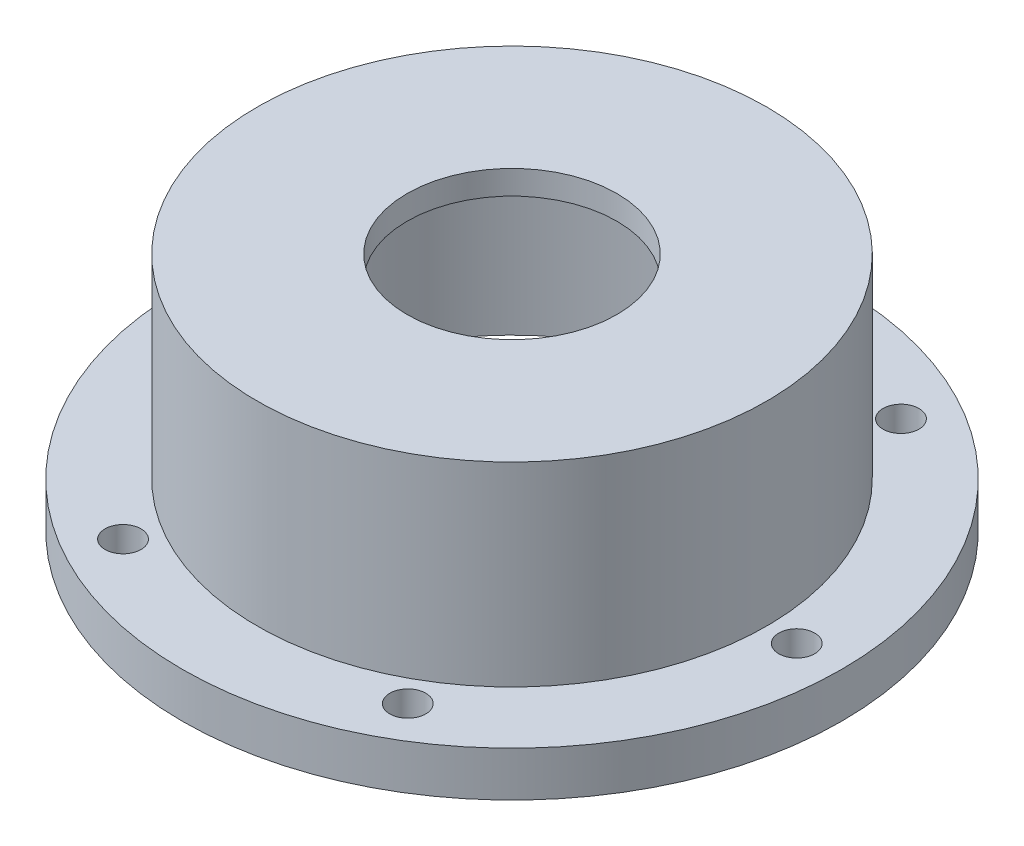
ISO-10303-21;
HEADER;
FILE_DESCRIPTION(('STEP AP214'),'2;1');
FILE_NAME('part.step','',(''),(''),'','','');
FILE_SCHEMA(('AUTOMOTIVE_DESIGN { 1 0 10303 214 1 1 1 1 }'));
ENDSEC;
DATA;
#1=APPLICATION_CONTEXT('core data for automotive mechanical design processes');
#2=APPLICATION_PROTOCOL_DEFINITION('international standard','automotive_design',2000,#1);
#3=PRODUCT_CONTEXT('',#1,'mechanical');
#4=PRODUCT('Part','Part','',(#3));
#5=PRODUCT_RELATED_PRODUCT_CATEGORY('part','',(#4));
#6=PRODUCT_DEFINITION_FORMATION('','',#4);
#7=PRODUCT_DEFINITION_CONTEXT('part definition',#1,'design');
#8=PRODUCT_DEFINITION('design','',#6,#7);
#9=PRODUCT_DEFINITION_SHAPE('','',#8);
#10=(LENGTH_UNIT() NAMED_UNIT(*) SI_UNIT(.MILLI.,.METRE.));
#11=(NAMED_UNIT(*) PLANE_ANGLE_UNIT() SI_UNIT($,.RADIAN.));
#12=(NAMED_UNIT(*) SI_UNIT($,.STERADIAN.) SOLID_ANGLE_UNIT());
#13=UNCERTAINTY_MEASURE_WITH_UNIT(LENGTH_MEASURE(1.E-05),#10,'distance_accuracy_value','');
#14=(GEOMETRIC_REPRESENTATION_CONTEXT(3) GLOBAL_UNCERTAINTY_ASSIGNED_CONTEXT((#13)) GLOBAL_UNIT_ASSIGNED_CONTEXT((#10,
#11,#12)) REPRESENTATION_CONTEXT('',''));
#15=CARTESIAN_POINT('',(0.,0.,0.));
#16=DIRECTION('',(0.,0.,1.));
#17=DIRECTION('',(1.,0.,0.));
#18=AXIS2_PLACEMENT_3D('',#15,#16,#17);
#19=CARTESIAN_POINT('',(0.,72.,0.));
#20=DIRECTION('',(0.,-1.,0.));
#21=DIRECTION('',(0.,0.,-1.));
#22=AXIS2_PLACEMENT_3D('',#19,#20,#21);
#23=PLANE('',#22);
#24=CARTESIAN_POINT('',(0.,72.,58.5));
#25=DIRECTION('',(0.,-1.,0.));
#26=DIRECTION('',(0.,0.,-1.));
#27=AXIS2_PLACEMENT_3D('',#24,#25,#26);
#28=CIRCLE('',#27,10.);
#29=CARTESIAN_POINT('',(0.,72.,48.5));
#30=VERTEX_POINT('',#29);
#31=EDGE_CURVE('E118',#30,#30,#28,.T.);
#32=ORIENTED_EDGE('',*,*,#31,.F.);
#33=EDGE_LOOP('',(#32));
#34=FACE_BOUND('',#33,.T.);
#35=CARTESIAN_POINT('',(58.5,72.,0.));
#36=DIRECTION('',(0.,-1.,0.));
#37=DIRECTION('',(0.,0.,-1.));
#38=AXIS2_PLACEMENT_3D('',#35,#36,#37);
#39=CIRCLE('',#38,10.0000000000002);
#40=CARTESIAN_POINT('',(58.5,72.,-10.0000000000002));
#41=VERTEX_POINT('',#40);
#42=EDGE_CURVE('E112',#41,#41,#39,.T.);
#43=ORIENTED_EDGE('',*,*,#42,.F.);
#44=EDGE_LOOP('',(#43));
#45=FACE_BOUND('',#44,.T.);
#46=CARTESIAN_POINT('',(0.,72.,-58.5));
#47=DIRECTION('',(0.,-1.,0.));
#48=DIRECTION('',(0.,0.,-1.));
#49=AXIS2_PLACEMENT_3D('',#46,#47,#48);
#50=CIRCLE('',#49,10.0000000000004);
#51=CARTESIAN_POINT('',(0.,72.,-68.5000000000004));
#52=VERTEX_POINT('',#51);
#53=EDGE_CURVE('E106',#52,#52,#50,.T.);
#54=ORIENTED_EDGE('',*,*,#53,.F.);
#55=EDGE_LOOP('',(#54));
#56=FACE_BOUND('',#55,.T.);
#57=CARTESIAN_POINT('',(-58.5,72.,0.));
#58=DIRECTION('',(0.,-1.,0.));
#59=DIRECTION('',(0.,0.,-1.));
#60=AXIS2_PLACEMENT_3D('',#57,#58,#59);
#61=CIRCLE('',#60,10.0000000000006);
#62=CARTESIAN_POINT('',(-58.5,72.,-10.0000000000006));
#63=VERTEX_POINT('',#62);
#64=EDGE_CURVE('E100',#63,#63,#61,.T.);
#65=ORIENTED_EDGE('',*,*,#64,.F.);
#66=EDGE_LOOP('',(#65));
#67=FACE_BOUND('',#66,.T.);
#68=CARTESIAN_POINT('',(0.,72.,0.));
#69=DIRECTION('',(0.,-1.,0.));
#70=DIRECTION('',(0.,0.,-1.));
#71=AXIS2_PLACEMENT_3D('',#68,#69,#70);
#72=CIRCLE('',#71,35.);
#73=CARTESIAN_POINT('',(0.,72.,-35.));
#74=VERTEX_POINT('',#73);
#75=EDGE_CURVE('E57',#74,#74,#72,.F.);
#76=ORIENTED_EDGE('',*,*,#75,.T.);
#77=EDGE_LOOP('',(#76));
#78=FACE_BOUND('',#77,.T.);
#79=CARTESIAN_POINT('',(0.,72.,0.));
#80=DIRECTION('',(0.,-1.,0.));
#81=DIRECTION('',(0.,0.,-1.));
#82=AXIS2_PLACEMENT_3D('',#79,#80,#81);
#83=CIRCLE('',#82,80.);
#84=CARTESIAN_POINT('',(0.,72.,-80.));
#85=VERTEX_POINT('',#84);
#86=EDGE_CURVE('E54',#85,#85,#83,.T.);
#87=ORIENTED_EDGE('',*,*,#86,.T.);
#88=EDGE_LOOP('',(#87));
#89=FACE_BOUND('',#88,.T.);
#90=ADVANCED_FACE('F32',(#34,#45,#56,#67,#78,#89),#23,.T.);
#91=CARTESIAN_POINT('',(0.,80.,0.));
#92=DIRECTION('',(0.,1.,0.));
#93=DIRECTION('',(0.,0.,1.));
#94=AXIS2_PLACEMENT_3D('',#91,#92,#93);
#95=PLANE('',#94);
#96=CARTESIAN_POINT('',(0.,80.,0.));
#97=DIRECTION('',(0.,1.,0.));
#98=DIRECTION('',(0.,0.,1.));
#99=AXIS2_PLACEMENT_3D('',#96,#97,#98);
#100=CIRCLE('',#99,35.);
#101=CARTESIAN_POINT('',(0.,80.,35.));
#102=VERTEX_POINT('',#101);
#103=EDGE_CURVE('E60',#102,#102,#100,.T.);
#104=ORIENTED_EDGE('',*,*,#103,.F.);
#105=EDGE_LOOP('',(#104));
#106=FACE_BOUND('',#105,.T.);
#107=CARTESIAN_POINT('',(0.,80.,0.));
#108=DIRECTION('',(0.,-1.,0.));
#109=DIRECTION('',(0.,0.,-1.));
#110=AXIS2_PLACEMENT_3D('',#107,#108,#109);
#111=CIRCLE('',#110,85.);
#112=CARTESIAN_POINT('',(0.,80.,-85.));
#113=VERTEX_POINT('',#112);
#114=EDGE_CURVE('E10',#113,#113,#111,.T.);
#115=ORIENTED_EDGE('',*,*,#114,.F.);
#116=EDGE_LOOP('',(#115));
#117=FACE_BOUND('',#116,.T.);
#118=ADVANCED_FACE('F135',(#106,#117),#95,.T.);
#119=CARTESIAN_POINT('',(0.,0.,0.));
#120=DIRECTION('',(0.,-1.,0.));
#121=DIRECTION('',(0.,0.,-1.));
#122=AXIS2_PLACEMENT_3D('',#119,#120,#121);
#123=CYLINDRICAL_SURFACE('',#122,85.);
#124=ORIENTED_EDGE('',*,*,#114,.T.);
#125=EDGE_LOOP('',(#124));
#126=FACE_BOUND('',#125,.T.);
#127=CARTESIAN_POINT('',(0.,15.,0.));
#128=DIRECTION('',(0.,-1.,0.));
#129=DIRECTION('',(0.,0.,-1.));
#130=AXIS2_PLACEMENT_3D('',#127,#128,#129);
#131=CIRCLE('',#130,85.);
#132=CARTESIAN_POINT('',(0.,15.,-85.));
#133=VERTEX_POINT('',#132);
#134=EDGE_CURVE('E38',#133,#133,#131,.T.);
#135=ORIENTED_EDGE('',*,*,#134,.F.);
#136=EDGE_LOOP('',(#135));
#137=FACE_BOUND('',#136,.T.);
#138=ADVANCED_FACE('F170',(#126,#137),#123,.T.);
#139=CARTESIAN_POINT('',(0.,15.,0.));
#140=DIRECTION('',(0.,1.,0.));
#141=DIRECTION('',(0.,0.,1.));
#142=AXIS2_PLACEMENT_3D('',#139,#140,#141);
#143=PLANE('',#142);
#144=CARTESIAN_POINT('',(-95.,15.,0.));
#145=DIRECTION('',(0.,1.,0.));
#146=DIRECTION('',(0.,0.,1.));
#147=AXIS2_PLACEMENT_3D('',#144,#145,#146);
#148=CIRCLE('',#147,5.99999999999999);
#149=CARTESIAN_POINT('',(-95.,15.,5.99999999999999));
#150=VERTEX_POINT('',#149);
#151=EDGE_CURVE('E96',#150,#150,#148,.T.);
#152=ORIENTED_EDGE('',*,*,#151,.F.);
#153=EDGE_LOOP('',(#152));
#154=FACE_BOUND('',#153,.T.);
#155=CARTESIAN_POINT('',(-47.5,15.,-82.2724133595217));
#156=DIRECTION('',(0.,1.,0.));
#157=DIRECTION('',(0.,0.,1.));
#158=AXIS2_PLACEMENT_3D('',#155,#156,#157);
#159=CIRCLE('',#158,5.99999999999998);
#160=CARTESIAN_POINT('',(-47.5,15.,-76.2724133595217));
#161=VERTEX_POINT('',#160);
#162=EDGE_CURVE('E90',#161,#161,#159,.T.);
#163=ORIENTED_EDGE('',*,*,#162,.F.);
#164=EDGE_LOOP('',(#163));
#165=FACE_BOUND('',#164,.T.);
#166=CARTESIAN_POINT('',(47.5000000000004,15.,-82.2724133595215));
#167=DIRECTION('',(0.,1.,0.));
#168=DIRECTION('',(0.,0.,1.));
#169=AXIS2_PLACEMENT_3D('',#166,#167,#168);
#170=CIRCLE('',#169,5.99999999999999);
#171=CARTESIAN_POINT('',(47.5000000000004,15.,-76.2724133595215));
#172=VERTEX_POINT('',#171);
#173=EDGE_CURVE('E84',#172,#172,#170,.T.);
#174=ORIENTED_EDGE('',*,*,#173,.F.);
#175=EDGE_LOOP('',(#174));
#176=FACE_BOUND('',#175,.T.);
#177=CARTESIAN_POINT('',(95.,15.,6.63381454380195E-13));
#178=DIRECTION('',(0.,1.,0.));
#179=DIRECTION('',(0.,0.,1.));
#180=AXIS2_PLACEMENT_3D('',#177,#178,#179);
#181=CIRCLE('',#180,5.99999999999999);
#182=CARTESIAN_POINT('',(95.,15.,6.00000000000065));
#183=VERTEX_POINT('',#182);
#184=EDGE_CURVE('E78',#183,#183,#181,.T.);
#185=ORIENTED_EDGE('',*,*,#184,.F.);
#186=EDGE_LOOP('',(#185));
#187=FACE_BOUND('',#186,.T.);
#188=CARTESIAN_POINT('',(47.4999999999993,15.,82.2724133595221));
#189=DIRECTION('',(0.,1.,0.));
#190=DIRECTION('',(0.,0.,1.));
#191=AXIS2_PLACEMENT_3D('',#188,#189,#190);
#192=CIRCLE('',#191,5.99999999999999);
#193=CARTESIAN_POINT('',(47.4999999999993,15.,88.2724133595221));
#194=VERTEX_POINT('',#193);
#195=EDGE_CURVE('E72',#194,#194,#192,.T.);
#196=ORIENTED_EDGE('',*,*,#195,.F.);
#197=EDGE_LOOP('',(#196));
#198=FACE_BOUND('',#197,.T.);
#199=CARTESIAN_POINT('',(-47.500000000001,15.,82.2724133595212));
#200=DIRECTION('',(0.,1.,0.));
#201=DIRECTION('',(0.,0.,1.));
#202=AXIS2_PLACEMENT_3D('',#199,#200,#201);
#203=CIRCLE('',#202,5.99999999999998);
#204=CARTESIAN_POINT('',(-47.500000000001,15.,88.2724133595211));
#205=VERTEX_POINT('',#204);
#206=EDGE_CURVE('E66',#205,#205,#203,.T.);
#207=ORIENTED_EDGE('',*,*,#206,.F.);
#208=EDGE_LOOP('',(#207));
#209=FACE_BOUND('',#208,.T.);
#210=ORIENTED_EDGE('',*,*,#134,.T.);
#211=EDGE_LOOP('',(#210));
#212=FACE_BOUND('',#211,.T.);
#213=CARTESIAN_POINT('',(0.,15.,0.));
#214=DIRECTION('',(0.,-1.,0.));
#215=DIRECTION('',(0.,0.,-1.));
#216=AXIS2_PLACEMENT_3D('',#213,#214,#215);
#217=CIRCLE('',#216,110.);
#218=CARTESIAN_POINT('',(0.,15.,-110.));
#219=VERTEX_POINT('',#218);
#220=EDGE_CURVE('E42',#219,#219,#217,.T.);
#221=ORIENTED_EDGE('',*,*,#220,.F.);
#222=EDGE_LOOP('',(#221));
#223=FACE_BOUND('',#222,.T.);
#224=ADVANCED_FACE('F166',(#154,#165,#176,#187,#198,#209,#212,#223),#143,.T.);
#225=CARTESIAN_POINT('',(0.,0.,0.));
#226=DIRECTION('',(0.,-1.,0.));
#227=DIRECTION('',(0.,0.,-1.));
#228=AXIS2_PLACEMENT_3D('',#225,#226,#227);
#229=CYLINDRICAL_SURFACE('',#228,110.);
#230=ORIENTED_EDGE('',*,*,#220,.T.);
#231=EDGE_LOOP('',(#230));
#232=FACE_BOUND('',#231,.T.);
#233=CARTESIAN_POINT('',(0.,0.,0.));
#234=DIRECTION('',(0.,-1.,0.));
#235=DIRECTION('',(0.,0.,-1.));
#236=AXIS2_PLACEMENT_3D('',#233,#234,#235);
#237=CIRCLE('',#236,110.);
#238=CARTESIAN_POINT('',(0.,0.,-110.));
#239=VERTEX_POINT('',#238);
#240=EDGE_CURVE('E46',#239,#239,#237,.T.);
#241=ORIENTED_EDGE('',*,*,#240,.F.);
#242=EDGE_LOOP('',(#241));
#243=FACE_BOUND('',#242,.T.);
#244=ADVANCED_FACE('F159',(#232,#243),#229,.T.);
#245=CARTESIAN_POINT('',(0.,0.,0.));
#246=DIRECTION('',(0.,-1.,0.));
#247=DIRECTION('',(0.,0.,-1.));
#248=AXIS2_PLACEMENT_3D('',#245,#246,#247);
#249=PLANE('',#248);
#250=CARTESIAN_POINT('',(-95.,0.,0.));
#251=DIRECTION('',(0.,1.,0.));
#252=DIRECTION('',(0.,0.,1.));
#253=AXIS2_PLACEMENT_3D('',#250,#251,#252);
#254=CIRCLE('',#253,5.99999999999999);
#255=CARTESIAN_POINT('',(-95.,0.,5.99999999999999));
#256=VERTEX_POINT('',#255);
#257=EDGE_CURVE('E93',#256,#256,#254,.T.);
#258=ORIENTED_EDGE('',*,*,#257,.T.);
#259=EDGE_LOOP('',(#258));
#260=FACE_BOUND('',#259,.T.);
#261=CARTESIAN_POINT('',(-47.5,0.,-82.2724133595217));
#262=DIRECTION('',(0.,1.,0.));
#263=DIRECTION('',(0.,0.,1.));
#264=AXIS2_PLACEMENT_3D('',#261,#262,#263);
#265=CIRCLE('',#264,6.);
#266=CARTESIAN_POINT('',(-47.5,0.,-76.2724133595217));
#267=VERTEX_POINT('',#266);
#268=EDGE_CURVE('E87',#267,#267,#265,.T.);
#269=ORIENTED_EDGE('',*,*,#268,.T.);
#270=EDGE_LOOP('',(#269));
#271=FACE_BOUND('',#270,.T.);
#272=CARTESIAN_POINT('',(47.5000000000004,0.,-82.2724133595215));
#273=DIRECTION('',(0.,1.,0.));
#274=DIRECTION('',(0.,0.,1.));
#275=AXIS2_PLACEMENT_3D('',#272,#273,#274);
#276=CIRCLE('',#275,6.);
#277=CARTESIAN_POINT('',(47.5000000000004,0.,-76.2724133595215));
#278=VERTEX_POINT('',#277);
#279=EDGE_CURVE('E81',#278,#278,#276,.T.);
#280=ORIENTED_EDGE('',*,*,#279,.T.);
#281=EDGE_LOOP('',(#280));
#282=FACE_BOUND('',#281,.T.);
#283=CARTESIAN_POINT('',(95.,0.,6.63381454380195E-13));
#284=DIRECTION('',(0.,1.,0.));
#285=DIRECTION('',(0.,0.,1.));
#286=AXIS2_PLACEMENT_3D('',#283,#284,#285);
#287=CIRCLE('',#286,5.99999999999999);
#288=CARTESIAN_POINT('',(95.,0.,6.00000000000065));
#289=VERTEX_POINT('',#288);
#290=EDGE_CURVE('E75',#289,#289,#287,.T.);
#291=ORIENTED_EDGE('',*,*,#290,.T.);
#292=EDGE_LOOP('',(#291));
#293=FACE_BOUND('',#292,.T.);
#294=CARTESIAN_POINT('',(47.4999999999993,0.,82.2724133595221));
#295=DIRECTION('',(0.,1.,0.));
#296=DIRECTION('',(0.,0.,1.));
#297=AXIS2_PLACEMENT_3D('',#294,#295,#296);
#298=CIRCLE('',#297,6.);
#299=CARTESIAN_POINT('',(47.4999999999993,0.,88.2724133595221));
#300=VERTEX_POINT('',#299);
#301=EDGE_CURVE('E69',#300,#300,#298,.T.);
#302=ORIENTED_EDGE('',*,*,#301,.T.);
#303=EDGE_LOOP('',(#302));
#304=FACE_BOUND('',#303,.T.);
#305=CARTESIAN_POINT('',(-47.500000000001,0.,82.2724133595212));
#306=DIRECTION('',(0.,1.,0.));
#307=DIRECTION('',(0.,0.,1.));
#308=AXIS2_PLACEMENT_3D('',#305,#306,#307);
#309=CIRCLE('',#308,6.);
#310=CARTESIAN_POINT('',(-47.500000000001,0.,88.2724133595212));
#311=VERTEX_POINT('',#310);
#312=EDGE_CURVE('E63',#311,#311,#309,.T.);
#313=ORIENTED_EDGE('',*,*,#312,.T.);
#314=EDGE_LOOP('',(#313));
#315=FACE_BOUND('',#314,.T.);
#316=ORIENTED_EDGE('',*,*,#240,.T.);
#317=EDGE_LOOP('',(#316));
#318=FACE_BOUND('',#317,.T.);
#319=CARTESIAN_POINT('',(0.,0.,0.));
#320=DIRECTION('',(0.,-1.,0.));
#321=DIRECTION('',(0.,0.,-1.));
#322=AXIS2_PLACEMENT_3D('',#319,#320,#321);
#323=CIRCLE('',#322,80.);
#324=CARTESIAN_POINT('',(0.,0.,-80.));
#325=VERTEX_POINT('',#324);
#326=EDGE_CURVE('E51',#325,#325,#323,.T.);
#327=ORIENTED_EDGE('',*,*,#326,.F.);
#328=EDGE_LOOP('',(#327));
#329=FACE_BOUND('',#328,.T.);
#330=ADVANCED_FACE('F149',(#260,#271,#282,#293,#304,#315,#318,#329),#249,.T.);
#331=CARTESIAN_POINT('',(0.,0.,0.));
#332=DIRECTION('',(0.,-1.,0.));
#333=DIRECTION('',(0.,0.,-1.));
#334=AXIS2_PLACEMENT_3D('',#331,#332,#333);
#335=CYLINDRICAL_SURFACE('',#334,80.);
#336=ORIENTED_EDGE('',*,*,#326,.T.);
#337=EDGE_LOOP('',(#336));
#338=FACE_BOUND('',#337,.T.);
#339=ORIENTED_EDGE('',*,*,#86,.F.);
#340=EDGE_LOOP('',(#339));
#341=FACE_BOUND('',#340,.T.);
#342=ADVANCED_FACE('F146',(#338,#341),#335,.F.);
#343=CARTESIAN_POINT('',(0.,-26.9949493661167,0.));
#344=DIRECTION('',(0.,1.,0.));
#345=DIRECTION('',(0.,0.,1.));
#346=AXIS2_PLACEMENT_3D('',#343,#344,#345);
#347=CYLINDRICAL_SURFACE('',#346,35.);
#348=ORIENTED_EDGE('',*,*,#103,.T.);
#349=EDGE_LOOP('',(#348));
#350=FACE_BOUND('',#349,.T.);
#351=ORIENTED_EDGE('',*,*,#75,.F.);
#352=EDGE_LOOP('',(#351));
#353=FACE_BOUND('',#352,.T.);
#354=ADVANCED_FACE('F148',(#350,#353),#347,.F.);
#355=CARTESIAN_POINT('',(-47.500000000001,15.,82.2724133595212));
#356=DIRECTION('',(0.,1.,0.));
#357=DIRECTION('',(0.,0.,1.));
#358=AXIS2_PLACEMENT_3D('',#355,#356,#357);
#359=CYLINDRICAL_SURFACE('',#358,5.99999999999999);
#360=ORIENTED_EDGE('',*,*,#312,.F.);
#361=EDGE_LOOP('',(#360));
#362=FACE_BOUND('',#361,.T.);
#363=ORIENTED_EDGE('',*,*,#206,.T.);
#364=EDGE_LOOP('',(#363));
#365=FACE_BOUND('',#364,.T.);
#366=ADVANCED_FACE('F156',(#362,#365),#359,.F.);
#367=CARTESIAN_POINT('',(47.4999999999993,15.,82.2724133595221));
#368=DIRECTION('',(0.,1.,0.));
#369=DIRECTION('',(0.,0.,1.));
#370=AXIS2_PLACEMENT_3D('',#367,#368,#369);
#371=CYLINDRICAL_SURFACE('',#370,5.99999999999999);
#372=ORIENTED_EDGE('',*,*,#301,.F.);
#373=EDGE_LOOP('',(#372));
#374=FACE_BOUND('',#373,.T.);
#375=ORIENTED_EDGE('',*,*,#195,.T.);
#376=EDGE_LOOP('',(#375));
#377=FACE_BOUND('',#376,.T.);
#378=ADVANCED_FACE('F209',(#374,#377),#371,.F.);
#379=CARTESIAN_POINT('',(95.,15.,6.63381454380195E-13));
#380=DIRECTION('',(0.,1.,0.));
#381=DIRECTION('',(0.,0.,1.));
#382=AXIS2_PLACEMENT_3D('',#379,#380,#381);
#383=CYLINDRICAL_SURFACE('',#382,5.99999999999999);
#384=ORIENTED_EDGE('',*,*,#290,.F.);
#385=EDGE_LOOP('',(#384));
#386=FACE_BOUND('',#385,.T.);
#387=ORIENTED_EDGE('',*,*,#184,.T.);
#388=EDGE_LOOP('',(#387));
#389=FACE_BOUND('',#388,.T.);
#390=ADVANCED_FACE('F219',(#386,#389),#383,.F.);
#391=CARTESIAN_POINT('',(47.5000000000004,15.,-82.2724133595215));
#392=DIRECTION('',(0.,1.,0.));
#393=DIRECTION('',(0.,0.,1.));
#394=AXIS2_PLACEMENT_3D('',#391,#392,#393);
#395=CYLINDRICAL_SURFACE('',#394,5.99999999999999);
#396=ORIENTED_EDGE('',*,*,#279,.F.);
#397=EDGE_LOOP('',(#396));
#398=FACE_BOUND('',#397,.T.);
#399=ORIENTED_EDGE('',*,*,#173,.T.);
#400=EDGE_LOOP('',(#399));
#401=FACE_BOUND('',#400,.T.);
#402=ADVANCED_FACE('F229',(#398,#401),#395,.F.);
#403=CARTESIAN_POINT('',(-47.5,15.,-82.2724133595217));
#404=DIRECTION('',(0.,1.,0.));
#405=DIRECTION('',(0.,0.,1.));
#406=AXIS2_PLACEMENT_3D('',#403,#404,#405);
#407=CYLINDRICAL_SURFACE('',#406,5.99999999999999);
#408=ORIENTED_EDGE('',*,*,#268,.F.);
#409=EDGE_LOOP('',(#408));
#410=FACE_BOUND('',#409,.T.);
#411=ORIENTED_EDGE('',*,*,#162,.T.);
#412=EDGE_LOOP('',(#411));
#413=FACE_BOUND('',#412,.T.);
#414=ADVANCED_FACE('F239',(#410,#413),#407,.F.);
#415=CARTESIAN_POINT('',(-95.,15.,0.));
#416=DIRECTION('',(0.,1.,0.));
#417=DIRECTION('',(0.,0.,1.));
#418=AXIS2_PLACEMENT_3D('',#415,#416,#417);
#419=CYLINDRICAL_SURFACE('',#418,5.99999999999999);
#420=ORIENTED_EDGE('',*,*,#257,.F.);
#421=EDGE_LOOP('',(#420));
#422=FACE_BOUND('',#421,.T.);
#423=ORIENTED_EDGE('',*,*,#151,.T.);
#424=EDGE_LOOP('',(#423));
#425=FACE_BOUND('',#424,.T.);
#426=ADVANCED_FACE('F249',(#422,#425),#419,.F.);
#427=CARTESIAN_POINT('',(-58.5,75.,0.));
#428=DIRECTION('',(0.,-1.,0.));
#429=DIRECTION('',(0.,0.,-1.));
#430=AXIS2_PLACEMENT_3D('',#427,#428,#429);
#431=CYLINDRICAL_SURFACE('',#430,10.0000000000006);
#432=CARTESIAN_POINT('',(-58.5,75.,0.));
#433=DIRECTION('',(0.,-1.,0.));
#434=DIRECTION('',(0.,0.,-1.));
#435=AXIS2_PLACEMENT_3D('',#432,#433,#434);
#436=CIRCLE('',#435,10.0000000000006);
#437=CARTESIAN_POINT('',(-58.5,75.,-10.0000000000006));
#438=VERTEX_POINT('',#437);
#439=EDGE_CURVE('E103',#438,#438,#436,.T.);
#440=ORIENTED_EDGE('',*,*,#439,.F.);
#441=EDGE_LOOP('',(#440));
#442=FACE_BOUND('',#441,.T.);
#443=ORIENTED_EDGE('',*,*,#64,.T.);
#444=EDGE_LOOP('',(#443));
#445=FACE_BOUND('',#444,.T.);
#446=ADVANCED_FACE('F258',(#442,#445),#431,.F.);
#447=CARTESIAN_POINT('',(-58.5,75.,0.));
#448=DIRECTION('',(0.,-1.,0.));
#449=DIRECTION('',(0.,0.,-1.));
#450=AXIS2_PLACEMENT_3D('',#447,#448,#449);
#451=PLANE('',#450);
#452=ORIENTED_EDGE('',*,*,#439,.T.);
#453=EDGE_LOOP('',(#452));
#454=FACE_BOUND('',#453,.T.);
#455=ADVANCED_FACE('F273',(#454),#451,.T.);
#456=CARTESIAN_POINT('',(0.,75.,-58.5));
#457=DIRECTION('',(0.,-1.,0.));
#458=DIRECTION('',(0.,0.,-1.));
#459=AXIS2_PLACEMENT_3D('',#456,#457,#458);
#460=CYLINDRICAL_SURFACE('',#459,10.0000000000004);
#461=CARTESIAN_POINT('',(0.,75.,-58.5));
#462=DIRECTION('',(0.,-1.,0.));
#463=DIRECTION('',(0.,0.,-1.));
#464=AXIS2_PLACEMENT_3D('',#461,#462,#463);
#465=CIRCLE('',#464,10.0000000000004);
#466=CARTESIAN_POINT('',(0.,75.,-68.5000000000004));
#467=VERTEX_POINT('',#466);
#468=EDGE_CURVE('E109',#467,#467,#465,.T.);
#469=ORIENTED_EDGE('',*,*,#468,.F.);
#470=EDGE_LOOP('',(#469));
#471=FACE_BOUND('',#470,.T.);
#472=ORIENTED_EDGE('',*,*,#53,.T.);
#473=EDGE_LOOP('',(#472));
#474=FACE_BOUND('',#473,.T.);
#475=ADVANCED_FACE('F283',(#471,#474),#460,.F.);
#476=CARTESIAN_POINT('',(0.,75.,-58.5));
#477=DIRECTION('',(0.,-1.,0.));
#478=DIRECTION('',(0.,0.,-1.));
#479=AXIS2_PLACEMENT_3D('',#476,#477,#478);
#480=PLANE('',#479);
#481=ORIENTED_EDGE('',*,*,#468,.T.);
#482=EDGE_LOOP('',(#481));
#483=FACE_BOUND('',#482,.T.);
#484=ADVANCED_FACE('F293',(#483),#480,.T.);
#485=CARTESIAN_POINT('',(58.5,75.,0.));
#486=DIRECTION('',(0.,-1.,0.));
#487=DIRECTION('',(0.,0.,-1.));
#488=AXIS2_PLACEMENT_3D('',#485,#486,#487);
#489=CYLINDRICAL_SURFACE('',#488,10.0000000000002);
#490=CARTESIAN_POINT('',(58.5,75.,0.));
#491=DIRECTION('',(0.,-1.,0.));
#492=DIRECTION('',(0.,0.,-1.));
#493=AXIS2_PLACEMENT_3D('',#490,#491,#492);
#494=CIRCLE('',#493,10.0000000000002);
#495=CARTESIAN_POINT('',(58.5,75.,-10.0000000000002));
#496=VERTEX_POINT('',#495);
#497=EDGE_CURVE('E115',#496,#496,#494,.T.);
#498=ORIENTED_EDGE('',*,*,#497,.F.);
#499=EDGE_LOOP('',(#498));
#500=FACE_BOUND('',#499,.T.);
#501=ORIENTED_EDGE('',*,*,#42,.T.);
#502=EDGE_LOOP('',(#501));
#503=FACE_BOUND('',#502,.T.);
#504=ADVANCED_FACE('F303',(#500,#503),#489,.F.);
#505=CARTESIAN_POINT('',(58.5,75.,0.));
#506=DIRECTION('',(0.,-1.,0.));
#507=DIRECTION('',(0.,0.,-1.));
#508=AXIS2_PLACEMENT_3D('',#505,#506,#507);
#509=PLANE('',#508);
#510=ORIENTED_EDGE('',*,*,#497,.T.);
#511=EDGE_LOOP('',(#510));
#512=FACE_BOUND('',#511,.T.);
#513=ADVANCED_FACE('F129',(#512),#509,.T.);
#514=CARTESIAN_POINT('',(0.,75.,58.5));
#515=DIRECTION('',(0.,-1.,0.));
#516=DIRECTION('',(0.,0.,-1.));
#517=AXIS2_PLACEMENT_3D('',#514,#515,#516);
#518=CYLINDRICAL_SURFACE('',#517,10.);
#519=CARTESIAN_POINT('',(0.,75.,58.5));
#520=DIRECTION('',(0.,-1.,0.));
#521=DIRECTION('',(0.,0.,-1.));
#522=AXIS2_PLACEMENT_3D('',#519,#520,#521);
#523=CIRCLE('',#522,10.);
#524=CARTESIAN_POINT('',(0.,75.,48.5));
#525=VERTEX_POINT('',#524);
#526=EDGE_CURVE('E99',#525,#525,#523,.T.);
#527=ORIENTED_EDGE('',*,*,#526,.F.);
#528=EDGE_LOOP('',(#527));
#529=FACE_BOUND('',#528,.T.);
#530=ORIENTED_EDGE('',*,*,#31,.T.);
#531=EDGE_LOOP('',(#530));
#532=FACE_BOUND('',#531,.T.);
#533=ADVANCED_FACE('F126',(#529,#532),#518,.F.);
#534=CARTESIAN_POINT('',(0.,75.,58.5));
#535=DIRECTION('',(0.,-1.,0.));
#536=DIRECTION('',(0.,0.,-1.));
#537=AXIS2_PLACEMENT_3D('',#534,#535,#536);
#538=PLANE('',#537);
#539=ORIENTED_EDGE('',*,*,#526,.T.);
#540=EDGE_LOOP('',(#539));
#541=FACE_BOUND('',#540,.T.);
#542=ADVANCED_FACE('F124',(#541),#538,.T.);
#543=CLOSED_SHELL('',(#90,#118,#138,#224,#244,#330,#342,#354,#366,#378,#390,#402,#414,#426,#446,
#455,#475,#484,#504,#513,#533,#542));
#544=MANIFOLD_SOLID_BREP('B2',#543);
#545=ADVANCED_BREP_SHAPE_REPRESENTATION('',(#18,#544),#14);
#546=SHAPE_DEFINITION_REPRESENTATION(#9,#545);
ENDSEC;
END-ISO-10303-21;
